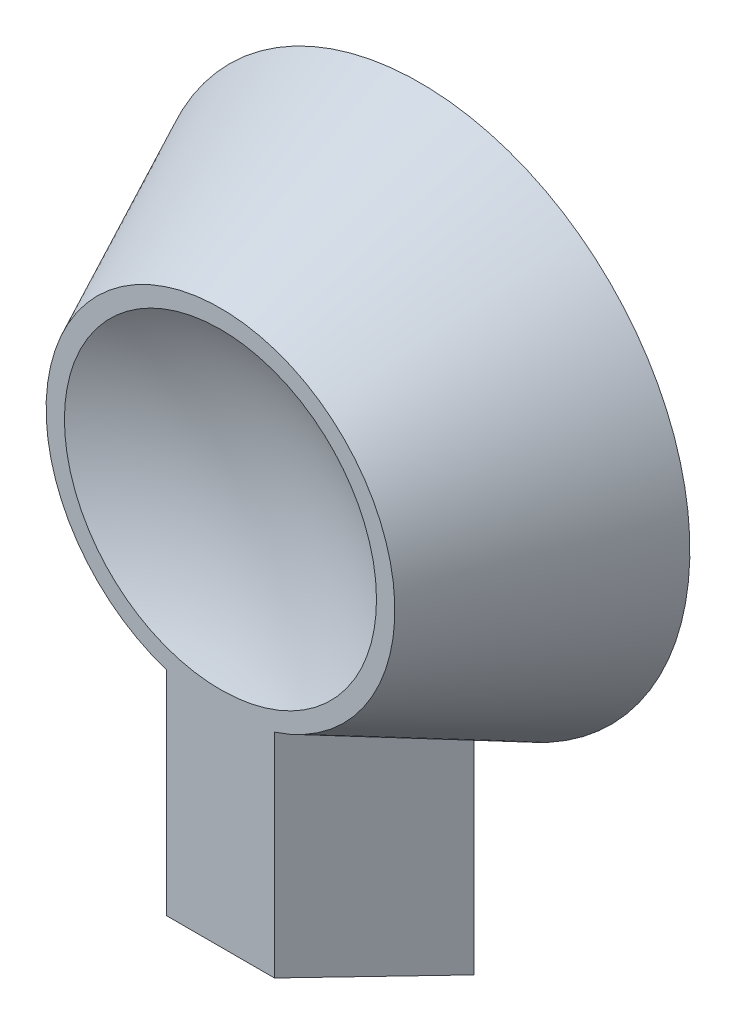
ISO-10303-21;
HEADER;
FILE_DESCRIPTION(('STEP AP214'),'2;1');
FILE_NAME('part.step','',(''),(''),'','','');
FILE_SCHEMA(('AUTOMOTIVE_DESIGN { 1 0 10303 214 1 1 1 1 }'));
ENDSEC;
DATA;
#1=APPLICATION_CONTEXT('core data for automotive mechanical design processes');
#2=APPLICATION_PROTOCOL_DEFINITION('international standard','automotive_design',2000,#1);
#3=PRODUCT_CONTEXT('',#1,'mechanical');
#4=PRODUCT('Part','Part','',(#3));
#5=PRODUCT_RELATED_PRODUCT_CATEGORY('part','',(#4));
#6=PRODUCT_DEFINITION_FORMATION('','',#4);
#7=PRODUCT_DEFINITION_CONTEXT('part definition',#1,'design');
#8=PRODUCT_DEFINITION('design','',#6,#7);
#9=PRODUCT_DEFINITION_SHAPE('','',#8);
#10=(LENGTH_UNIT() NAMED_UNIT(*) SI_UNIT(.MILLI.,.METRE.));
#11=(NAMED_UNIT(*) PLANE_ANGLE_UNIT() SI_UNIT($,.RADIAN.));
#12=(NAMED_UNIT(*) SI_UNIT($,.STERADIAN.) SOLID_ANGLE_UNIT());
#13=UNCERTAINTY_MEASURE_WITH_UNIT(LENGTH_MEASURE(1.E-05),#10,'distance_accuracy_value','');
#14=(GEOMETRIC_REPRESENTATION_CONTEXT(3) GLOBAL_UNCERTAINTY_ASSIGNED_CONTEXT((#13)) GLOBAL_UNIT_ASSIGNED_CONTEXT((#10,
#11,#12)) REPRESENTATION_CONTEXT('',''));
#15=CARTESIAN_POINT('',(0.,0.,0.));
#16=DIRECTION('',(0.,0.,1.));
#17=DIRECTION('',(1.,0.,0.));
#18=AXIS2_PLACEMENT_3D('',#15,#16,#17);
#19=CARTESIAN_POINT('',(1.75,-0.8658834987988,0.));
#20=DIRECTION('',(1.,0.,0.));
#21=DIRECTION('',(0.,0.,-1.));
#22=AXIS2_PLACEMENT_3D('',#19,#20,#21);
#23=PLANE('',#22);
#24=DIRECTION('',(0.,1.,0.));
#25=VECTOR('',#24,1.);
#26=CARTESIAN_POINT('',(1.75,3.817865,4.3));
#27=LINE('',#26,#25);
#28=CARTESIAN_POINT('',(1.75,-0.865883498798799,4.3));
#29=VERTEX_POINT('',#28);
#30=CARTESIAN_POINT('',(1.75000000000007,-1.92125514162448,4.3));
#31=VERTEX_POINT('',#30);
#32=EDGE_CURVE('E243',#29,#31,#27,.F.);
#33=ORIENTED_EDGE('',*,*,#32,.F.);
#34=DIRECTION('',(0.,0.,-1.));
#35=VECTOR('',#34,1.);
#36=CARTESIAN_POINT('',(1.75,-0.865883498798799,0.));
#37=LINE('',#36,#35);
#38=CARTESIAN_POINT('',(1.75,-0.865883498798799,0.));
#39=VERTEX_POINT('',#38);
#40=EDGE_CURVE('E240',#39,#29,#37,.F.);
#41=ORIENTED_EDGE('',*,*,#40,.F.);
#42=DIRECTION('',(0.,1.,0.));
#43=VECTOR('',#42,1.);
#44=CARTESIAN_POINT('',(1.75,-0.8658834987988,0.));
#45=LINE('',#44,#43);
#46=CARTESIAN_POINT('',(1.75000000000007,-1.92125514162448,0.));
#47=VERTEX_POINT('',#46);
#48=EDGE_CURVE('E262',#47,#39,#45,.T.);
#49=ORIENTED_EDGE('',*,*,#48,.F.);
#50=DIRECTION('',(0.,0.,-1.));
#51=VECTOR('',#50,1.);
#52=CARTESIAN_POINT('',(1.75000000000014,-1.92125514162446,0.));
#53=LINE('',#52,#51);
#54=EDGE_CURVE('E254',#47,#31,#53,.F.);
#55=ORIENTED_EDGE('',*,*,#54,.T.);
#56=EDGE_LOOP('',(#33,#41,#49,#55));
#57=FACE_BOUND('',#56,.T.);
#58=ADVANCED_FACE('F15',(#57),#23,.F.);
#59=CARTESIAN_POINT('',(1.75,9.556985141624,0.));
#60=DIRECTION('',(1.,0.,0.));
#61=DIRECTION('',(0.,0.,-1.));
#62=AXIS2_PLACEMENT_3D('',#59,#60,#61);
#63=PLANE('',#62);
#64=DIRECTION('',(0.,1.,0.));
#65=VECTOR('',#64,1.);
#66=CARTESIAN_POINT('',(1.75,3.817865,4.3));
#67=LINE('',#66,#65);
#68=CARTESIAN_POINT('',(1.75000000000007,9.55698514162448,4.3));
#69=VERTEX_POINT('',#68);
#70=CARTESIAN_POINT('',(1.74999999999997,8.50161349879881,4.3));
#71=VERTEX_POINT('',#70);
#72=EDGE_CURVE('E251',#69,#71,#67,.F.);
#73=ORIENTED_EDGE('',*,*,#72,.F.);
#74=DIRECTION('',(0.,0.,-1.));
#75=VECTOR('',#74,1.);
#76=CARTESIAN_POINT('',(1.75000000000014,9.55698514162446,0.));
#77=LINE('',#76,#75);
#78=CARTESIAN_POINT('',(1.75000000000007,9.55698514162448,0.));
#79=VERTEX_POINT('',#78);
#80=EDGE_CURVE('E227',#69,#79,#77,.T.);
#81=ORIENTED_EDGE('',*,*,#80,.T.);
#82=DIRECTION('',(0.,1.,0.));
#83=VECTOR('',#82,1.);
#84=CARTESIAN_POINT('',(1.75,9.556985141624,0.));
#85=LINE('',#84,#83);
#86=CARTESIAN_POINT('',(1.74999999999997,8.50161349879881,0.));
#87=VERTEX_POINT('',#86);
#88=EDGE_CURVE('E260',#87,#79,#85,.T.);
#89=ORIENTED_EDGE('',*,*,#88,.F.);
#90=DIRECTION('',(0.,0.,-1.));
#91=VECTOR('',#90,1.);
#92=CARTESIAN_POINT('',(1.74999999999993,8.50161349879882,0.));
#93=LINE('',#92,#91);
#94=EDGE_CURVE('E228',#71,#87,#93,.T.);
#95=ORIENTED_EDGE('',*,*,#94,.F.);
#96=EDGE_LOOP('',(#73,#81,#89,#95));
#97=FACE_BOUND('',#96,.T.);
#98=ADVANCED_FACE('F310',(#97),#63,.F.);
#99=CARTESIAN_POINT('',(0.,3.817865,0.));
#100=DIRECTION('',(0.,0.,-1.));
#101=DIRECTION('',(-1.,0.,0.));
#102=AXIS2_PLACEMENT_3D('',#99,#100,#101);
#103=CYLINDRICAL_SURFACE('',#102,6.);
#104=ORIENTED_EDGE('',*,*,#54,.F.);
#105=CARTESIAN_POINT('',(0.,3.817865,0.));
#106=DIRECTION('',(0.,0.,-1.));
#107=DIRECTION('',(-1.,0.,0.));
#108=AXIS2_PLACEMENT_3D('',#105,#106,#107);
#109=CIRCLE('',#108,6.);
#110=CARTESIAN_POINT('',(1.59687194226616,-1.965732496369,0.));
#111=VERTEX_POINT('',#110);
#112=EDGE_CURVE('E18',#111,#47,#109,.F.);
#113=ORIENTED_EDGE('',*,*,#112,.F.);
#114=DIRECTION('',(0.,0.,1.));
#115=VECTOR('',#114,1.);
#116=CARTESIAN_POINT('',(1.596871942267,-1.965732496369,0.));
#117=LINE('',#116,#115);
#118=CARTESIAN_POINT('',(1.59687194226616,-1.965732496369,4.3));
#119=VERTEX_POINT('',#118);
#120=EDGE_CURVE('E274',#119,#111,#117,.F.);
#121=ORIENTED_EDGE('',*,*,#120,.F.);
#122=CARTESIAN_POINT('',(0.,3.817865,4.3));
#123=DIRECTION('',(0.,0.,-1.));
#124=DIRECTION('',(-1.,0.,0.));
#125=AXIS2_PLACEMENT_3D('',#122,#123,#124);
#126=CIRCLE('',#125,6.);
#127=EDGE_CURVE('E241',#31,#119,#126,.T.);
#128=ORIENTED_EDGE('',*,*,#127,.F.);
#129=EDGE_LOOP('',(#104,#113,#121,#128));
#130=FACE_BOUND('',#129,.T.);
#131=ADVANCED_FACE('F273',(#130),#103,.F.);
#132=CARTESIAN_POINT('',(0.,3.817865,4.3));
#133=DIRECTION('',(0.,0.,-1.));
#134=DIRECTION('',(-1.,0.,0.));
#135=AXIS2_PLACEMENT_3D('',#132,#133,#134);
#136=PLANE('',#135);
#137=ORIENTED_EDGE('',*,*,#127,.T.);
#138=DIRECTION('',(1.,0.,0.));
#139=VECTOR('',#138,1.);
#140=CARTESIAN_POINT('',(-2.,-1.965732496369,4.3));
#141=LINE('',#140,#139);
#142=CARTESIAN_POINT('',(-1.59687194226616,-1.965732496369,4.3));
#143=VERTEX_POINT('',#142);
#144=EDGE_CURVE('E129',#143,#119,#141,.T.);
#145=ORIENTED_EDGE('',*,*,#144,.F.);
#146=CARTESIAN_POINT('',(0.,3.817865,4.3));
#147=DIRECTION('',(0.,0.,-1.));
#148=DIRECTION('',(-1.,0.,0.));
#149=AXIS2_PLACEMENT_3D('',#146,#147,#148);
#150=CIRCLE('',#149,6.);
#151=EDGE_CURVE('E224',#143,#69,#150,.T.);
#152=ORIENTED_EDGE('',*,*,#151,.T.);
#153=ORIENTED_EDGE('',*,*,#72,.T.);
#154=CARTESIAN_POINT('',(0.,3.817865,4.3));
#155=DIRECTION('',(0.,0.,-1.));
#156=DIRECTION('',(-1.,0.,0.));
#157=AXIS2_PLACEMENT_3D('',#154,#155,#156);
#158=CIRCLE('',#157,5.);
#159=CARTESIAN_POINT('',(-4.89897948556635,4.81786500000004,4.3));
#160=VERTEX_POINT('',#159);
#161=EDGE_CURVE('E229',#160,#71,#158,.T.);
#162=ORIENTED_EDGE('',*,*,#161,.F.);
#163=DIRECTION('',(1.,0.,0.));
#164=VECTOR('',#163,1.);
#165=CARTESIAN_POINT('',(-4.898979485566,4.817865,4.3));
#166=LINE('',#165,#164);
#167=CARTESIAN_POINT('',(-2.93428015022412,4.817865,4.3));
#168=VERTEX_POINT('',#167);
#169=EDGE_CURVE('E263',#160,#168,#166,.T.);
#170=ORIENTED_EDGE('',*,*,#169,.T.);
#171=CARTESIAN_POINT('',(0.,3.817865,4.3));
#172=DIRECTION('',(0.,0.,-1.));
#173=DIRECTION('',(-1.,0.,0.));
#174=AXIS2_PLACEMENT_3D('',#171,#172,#173);
#175=CIRCLE('',#174,3.1);
#176=CARTESIAN_POINT('',(-2.93428015022423,2.81786499999996,4.3));
#177=VERTEX_POINT('',#176);
#178=EDGE_CURVE('E233',#168,#177,#175,.T.);
#179=ORIENTED_EDGE('',*,*,#178,.T.);
#180=DIRECTION('',(1.,0.,0.));
#181=VECTOR('',#180,1.);
#182=CARTESIAN_POINT('',(-2.934280150224,2.817865,4.3));
#183=LINE('',#182,#181);
#184=CARTESIAN_POINT('',(-4.89897948556618,2.817865,4.3));
#185=VERTEX_POINT('',#184);
#186=EDGE_CURVE('E239',#177,#185,#183,.F.);
#187=ORIENTED_EDGE('',*,*,#186,.T.);
#188=CARTESIAN_POINT('',(0.,3.817865,4.3));
#189=DIRECTION('',(0.,0.,-1.));
#190=DIRECTION('',(-1.,0.,0.));
#191=AXIS2_PLACEMENT_3D('',#188,#189,#190);
#192=CIRCLE('',#191,5.);
#193=EDGE_CURVE('E237',#29,#185,#192,.T.);
#194=ORIENTED_EDGE('',*,*,#193,.F.);
#195=ORIENTED_EDGE('',*,*,#32,.T.);
#196=EDGE_LOOP('',(#137,#145,#152,#153,#162,#170,#179,#187,#194,#195));
#197=FACE_BOUND('',#196,.T.);
#198=ADVANCED_FACE('F406',(#197),#136,.T.);
#199=CARTESIAN_POINT('',(0.,3.817865,0.));
#200=DIRECTION('',(0.,0.,-1.));
#201=DIRECTION('',(-1.,0.,0.));
#202=AXIS2_PLACEMENT_3D('',#199,#200,#201);
#203=CYLINDRICAL_SURFACE('',#202,5.);
#204=DIRECTION('',(0.,0.,-1.));
#205=VECTOR('',#204,1.);
#206=CARTESIAN_POINT('',(-4.898979485566,2.817865,0.));
#207=LINE('',#206,#205);
#208=CARTESIAN_POINT('',(-4.89897948556618,2.817865,0.));
#209=VERTEX_POINT('',#208);
#210=EDGE_CURVE('E236',#185,#209,#207,.T.);
#211=ORIENTED_EDGE('',*,*,#210,.T.);
#212=CARTESIAN_POINT('',(0.,3.817865,0.));
#213=DIRECTION('',(0.,0.,-1.));
#214=DIRECTION('',(-1.,0.,0.));
#215=AXIS2_PLACEMENT_3D('',#212,#213,#214);
#216=CIRCLE('',#215,5.);
#217=EDGE_CURVE('E135',#39,#209,#216,.T.);
#218=ORIENTED_EDGE('',*,*,#217,.F.);
#219=ORIENTED_EDGE('',*,*,#40,.T.);
#220=ORIENTED_EDGE('',*,*,#193,.T.);
#221=EDGE_LOOP('',(#211,#218,#219,#220));
#222=FACE_BOUND('',#221,.T.);
#223=ADVANCED_FACE('F291',(#222),#203,.T.);
#224=CARTESIAN_POINT('',(-2.934280150224,2.817865,0.));
#225=DIRECTION('',(0.,-1.,0.));
#226=DIRECTION('',(0.,0.,-1.));
#227=AXIS2_PLACEMENT_3D('',#224,#225,#226);
#228=PLANE('',#227);
#229=ORIENTED_EDGE('',*,*,#186,.F.);
#230=DIRECTION('',(0.,0.,-1.));
#231=VECTOR('',#230,1.);
#232=CARTESIAN_POINT('',(-2.93428015022422,2.81786499999993,7.77));
#233=LINE('',#232,#231);
#234=CARTESIAN_POINT('',(-2.93428015022423,2.81786499999996,0.));
#235=VERTEX_POINT('',#234);
#236=EDGE_CURVE('E235',#177,#235,#233,.T.);
#237=ORIENTED_EDGE('',*,*,#236,.T.);
#238=DIRECTION('',(-1.,0.,0.));
#239=VECTOR('',#238,1.);
#240=CARTESIAN_POINT('',(0.,2.817865,0.));
#241=LINE('',#240,#239);
#242=EDGE_CURVE('E144',#209,#235,#241,.F.);
#243=ORIENTED_EDGE('',*,*,#242,.F.);
#244=ORIENTED_EDGE('',*,*,#210,.F.);
#245=EDGE_LOOP('',(#229,#237,#243,#244));
#246=FACE_BOUND('',#245,.T.);
#247=ADVANCED_FACE('F294',(#246),#228,.F.);
#248=CARTESIAN_POINT('',(0.,3.817865,7.77));
#249=DIRECTION('',(0.,0.,-1.));
#250=DIRECTION('',(-1.,0.,0.));
#251=AXIS2_PLACEMENT_3D('',#248,#249,#250);
#252=CYLINDRICAL_SURFACE('',#251,3.1);
#253=ORIENTED_EDGE('',*,*,#178,.F.);
#254=DIRECTION('',(0.,0.,1.));
#255=VECTOR('',#254,1.);
#256=CARTESIAN_POINT('',(-2.934280150224,4.817865,0.));
#257=LINE('',#256,#255);
#258=CARTESIAN_POINT('',(-2.93428015022412,4.817865,0.));
#259=VERTEX_POINT('',#258);
#260=EDGE_CURVE('E265',#168,#259,#257,.F.);
#261=ORIENTED_EDGE('',*,*,#260,.T.);
#262=CARTESIAN_POINT('',(0.,3.817865,0.));
#263=DIRECTION('',(0.,0.,-1.));
#264=DIRECTION('',(-1.,0.,0.));
#265=AXIS2_PLACEMENT_3D('',#262,#263,#264);
#266=CIRCLE('',#265,3.1);
#267=EDGE_CURVE('E213',#235,#259,#266,.F.);
#268=ORIENTED_EDGE('',*,*,#267,.F.);
#269=ORIENTED_EDGE('',*,*,#236,.F.);
#270=EDGE_LOOP('',(#253,#261,#268,#269));
#271=FACE_BOUND('',#270,.T.);
#272=ADVANCED_FACE('F298',(#271),#252,.F.);
#273=CARTESIAN_POINT('',(-4.898979485566,4.817865,0.));
#274=DIRECTION('',(0.,1.,0.));
#275=DIRECTION('',(0.,0.,1.));
#276=AXIS2_PLACEMENT_3D('',#273,#274,#275);
#277=PLANE('',#276);
#278=ORIENTED_EDGE('',*,*,#169,.F.);
#279=DIRECTION('',(0.,0.,-1.));
#280=VECTOR('',#279,1.);
#281=CARTESIAN_POINT('',(-4.89897948556634,4.81786500000007,0.));
#282=LINE('',#281,#280);
#283=CARTESIAN_POINT('',(-4.89897948556635,4.81786500000004,0.));
#284=VERTEX_POINT('',#283);
#285=EDGE_CURVE('E232',#284,#160,#282,.F.);
#286=ORIENTED_EDGE('',*,*,#285,.F.);
#287=DIRECTION('',(-1.,0.,0.));
#288=VECTOR('',#287,1.);
#289=CARTESIAN_POINT('',(0.,4.817865,0.));
#290=LINE('',#289,#288);
#291=EDGE_CURVE('E210',#259,#284,#290,.T.);
#292=ORIENTED_EDGE('',*,*,#291,.F.);
#293=ORIENTED_EDGE('',*,*,#260,.F.);
#294=EDGE_LOOP('',(#278,#286,#292,#293));
#295=FACE_BOUND('',#294,.T.);
#296=ADVANCED_FACE('F301',(#295),#277,.F.);
#297=CARTESIAN_POINT('',(0.,3.817865,0.));
#298=DIRECTION('',(0.,0.,-1.));
#299=DIRECTION('',(-1.,0.,0.));
#300=AXIS2_PLACEMENT_3D('',#297,#298,#299);
#301=CYLINDRICAL_SURFACE('',#300,5.);
#302=ORIENTED_EDGE('',*,*,#94,.T.);
#303=CARTESIAN_POINT('',(0.,3.817865,0.));
#304=DIRECTION('',(0.,0.,-1.));
#305=DIRECTION('',(-1.,0.,0.));
#306=AXIS2_PLACEMENT_3D('',#303,#304,#305);
#307=CIRCLE('',#306,5.);
#308=EDGE_CURVE('E212',#284,#87,#307,.T.);
#309=ORIENTED_EDGE('',*,*,#308,.F.);
#310=ORIENTED_EDGE('',*,*,#285,.T.);
#311=ORIENTED_EDGE('',*,*,#161,.T.);
#312=EDGE_LOOP('',(#302,#309,#310,#311));
#313=FACE_BOUND('',#312,.T.);
#314=ADVANCED_FACE('F305',(#313),#301,.T.);
#315=CARTESIAN_POINT('',(0.,3.817865,0.));
#316=DIRECTION('',(0.,0.,-1.));
#317=DIRECTION('',(-1.,0.,0.));
#318=AXIS2_PLACEMENT_3D('',#315,#316,#317);
#319=CYLINDRICAL_SURFACE('',#318,6.);
#320=ORIENTED_EDGE('',*,*,#80,.F.);
#321=ORIENTED_EDGE('',*,*,#151,.F.);
#322=DIRECTION('',(0.,0.,1.));
#323=VECTOR('',#322,1.);
#324=CARTESIAN_POINT('',(-1.596871942267,-1.965732496369,0.));
#325=LINE('',#324,#323);
#326=CARTESIAN_POINT('',(-1.59687194226616,-1.965732496369,0.));
#327=VERTEX_POINT('',#326);
#328=EDGE_CURVE('E259',#327,#143,#325,.T.);
#329=ORIENTED_EDGE('',*,*,#328,.F.);
#330=CARTESIAN_POINT('',(0.,3.817865,0.));
#331=DIRECTION('',(0.,0.,-1.));
#332=DIRECTION('',(-1.,0.,0.));
#333=AXIS2_PLACEMENT_3D('',#330,#331,#332);
#334=CIRCLE('',#333,6.);
#335=EDGE_CURVE('E175',#79,#327,#334,.F.);
#336=ORIENTED_EDGE('',*,*,#335,.F.);
#337=EDGE_LOOP('',(#320,#321,#329,#336));
#338=FACE_BOUND('',#337,.T.);
#339=ADVANCED_FACE('F312',(#338),#319,.F.);
#340=CARTESIAN_POINT('',(-2.,-1.965732496369,0.));
#341=DIRECTION('',(0.,1.,0.));
#342=DIRECTION('',(0.,0.,1.));
#343=AXIS2_PLACEMENT_3D('',#340,#341,#342);
#344=PLANE('',#343);
#345=ORIENTED_EDGE('',*,*,#328,.T.);
#346=ORIENTED_EDGE('',*,*,#144,.T.);
#347=ORIENTED_EDGE('',*,*,#120,.T.);
#348=DIRECTION('',(-1.,0.,0.));
#349=VECTOR('',#348,1.);
#350=CARTESIAN_POINT('',(0.,-1.965732496369,0.));
#351=LINE('',#350,#349);
#352=EDGE_CURVE('E208',#327,#111,#351,.F.);
#353=ORIENTED_EDGE('',*,*,#352,.F.);
#354=EDGE_LOOP('',(#345,#346,#347,#353));
#355=FACE_BOUND('',#354,.T.);
#356=ADVANCED_FACE('F313',(#355),#344,.T.);
#357=CARTESIAN_POINT('',(-2.,-10.22173249637,7.4));
#358=DIRECTION('',(0.,-0.899235088745799,0.4374657188493));
#359=DIRECTION('',(0.,-0.4374657188493,-0.899235088745799));
#360=AXIS2_PLACEMENT_3D('',#357,#358,#359);
#361=PLANE('',#360);
#362=DIRECTION('',(-1.,0.,0.));
#363=VECTOR('',#362,1.);
#364=CARTESIAN_POINT('',(0.,-10.22173249637,7.4));
#365=LINE('',#364,#363);
#366=CARTESIAN_POINT('',(2.,-10.22173249637,7.4));
#367=VERTEX_POINT('',#366);
#368=CARTESIAN_POINT('',(-2.,-10.22173249637,7.4));
#369=VERTEX_POINT('',#368);
#370=EDGE_CURVE('E195',#367,#369,#365,.T.);
#371=ORIENTED_EDGE('',*,*,#370,.T.);
#372=DIRECTION('',(0.,-0.437465718849306,-0.899235088745796));
#373=VECTOR('',#372,1.);
#374=CARTESIAN_POINT('',(-2.,-10.22173249637,7.4));
#375=LINE('',#374,#373);
#376=CARTESIAN_POINT('',(-2.,-13.82173249637,0.));
#377=VERTEX_POINT('',#376);
#378=EDGE_CURVE('E114',#369,#377,#375,.T.);
#379=ORIENTED_EDGE('',*,*,#378,.T.);
#380=DIRECTION('',(-1.,0.,0.));
#381=VECTOR('',#380,1.);
#382=CARTESIAN_POINT('',(0.,-13.82173249637,0.));
#383=LINE('',#382,#381);
#384=CARTESIAN_POINT('',(2.,-13.82173249637,0.));
#385=VERTEX_POINT('',#384);
#386=EDGE_CURVE('E131',#385,#377,#383,.T.);
#387=ORIENTED_EDGE('',*,*,#386,.F.);
#388=DIRECTION('',(0.,-0.437465718849306,-0.899235088745796));
#389=VECTOR('',#388,1.);
#390=CARTESIAN_POINT('',(2.,-10.22173249637,7.4));
#391=LINE('',#390,#389);
#392=EDGE_CURVE('E121',#367,#385,#391,.T.);
#393=ORIENTED_EDGE('',*,*,#392,.F.);
#394=EDGE_LOOP('',(#371,#379,#387,#393));
#395=FACE_BOUND('',#394,.T.);
#396=ADVANCED_FACE('F132',(#395),#361,.T.);
#397=CARTESIAN_POINT('',(0.,3.817865,17.8));
#398=DIRECTION('',(0.,1.,0.));
#399=DIRECTION('',(1.,0.,0.));
#400=AXIS2_PLACEMENT_3D('',#397,#398,#399);
#401=SPHERICAL_SURFACE('',#400,11.9);
#402=CARTESIAN_POINT('',(0.,9.6014624963685,7.4));
#403=CARTESIAN_POINT('',(-0.162385112842373,9.6014615999479,7.4));
#404=CARTESIAN_POINT('',(-0.324799662774053,9.59461788359165,7.4));
#405=CARTESIAN_POINT('',(-0.648509002274006,9.56728538636666,7.4));
#406=CARTESIAN_POINT('',(-0.809803447044471,9.54679257704734,7.4));
#407=CARTESIAN_POINT('',(-1.13035452130641,9.49226093474803,7.4));
#408=CARTESIAN_POINT('',(-1.28960749980464,9.45820059902386,7.4));
#409=CARTESIAN_POINT('',(-1.60480248432001,9.37674325120136,7.4));
#410=CARTESIAN_POINT('',(-1.76074169254806,9.32933541626701,7.4));
#411=CARTESIAN_POINT('',(-2.06779995174507,9.2216256375165,7.4));
#412=CARTESIAN_POINT('',(-2.21892683964794,9.16134603496777,7.4));
#413=CARTESIAN_POINT('',(-2.51563404224363,9.02824265569629,7.4));
#414=CARTESIAN_POINT('',(-2.66121181413952,8.95541321061988,7.4));
#415=CARTESIAN_POINT('',(-2.94571843084404,8.79774399336454,7.4));
#416=CARTESIAN_POINT('',(-3.0846470252759,8.71290376939151,7.4));
#417=CARTESIAN_POINT('',(-3.35480012443071,8.5318595021097,7.4));
#418=CARTESIAN_POINT('',(-3.4860280809834,8.43566060950822,7.4));
#419=CARTESIAN_POINT('',(-3.73999751829261,8.23248623481109,7.4));
#420=CARTESIAN_POINT('',(-3.86273346057584,8.12550382940401,7.4));
#421=CARTESIAN_POINT('',(-4.0986383579975,7.90168365966581,7.4));
#422=CARTESIAN_POINT('',(-4.2118164230588,7.78485549683446,7.4));
#423=CARTESIAN_POINT('',(-4.42798297598401,7.54202957569374,7.4));
#424=CARTESIAN_POINT('',(-4.53096682483061,7.41602768760781,7.4));
#425=CARTESIAN_POINT('',(-4.72597716427352,7.15576661313264,7.4));
#426=CARTESIAN_POINT('',(-4.81800111149726,7.02150552101891,7.4));
#427=CARTESIAN_POINT('',(-4.99038038122151,6.74575385559565,7.4));
#428=CARTESIAN_POINT('',(-5.07073963414182,6.60426573925796,7.4));
#429=CARTESIAN_POINT('',(-5.21928283170522,6.31497045061441,7.4));
#430=CARTESIAN_POINT('',(-5.28746227899115,6.16716096902873,7.4));
#431=CARTESIAN_POINT('',(-5.41110091054866,5.86638049614845,7.4));
#432=CARTESIAN_POINT('',(-5.46656494321386,5.71341149778732,7.4));
#433=CARTESIAN_POINT('',(-5.56443027611718,5.40328740140273,7.4));
#434=CARTESIAN_POINT('',(-5.60682667959787,5.24613075807557,7.4));
#435=CARTESIAN_POINT('',(-5.67821249740234,4.92886897512301,7.4));
#436=CARTESIAN_POINT('',(-5.70720737740913,4.76876506526371,7.4));
#437=CARTESIAN_POINT('',(-5.75161971452016,4.44661099763155,7.4));
#438=CARTESIAN_POINT('',(-5.76703101299272,4.28455999078391,7.4));
#439=CARTESIAN_POINT('',(-5.78414415644978,3.95973570398962,7.4));
#440=CARTESIAN_POINT('',(-5.78584600143428,3.79696242404296,7.4));
#441=CARTESIAN_POINT('',(-5.77553049852065,3.47192505791524,7.4));
#442=CARTESIAN_POINT('',(-5.76351936437878,3.30966077449011,7.4));
#443=CARTESIAN_POINT('',(-5.72586563703813,2.98665431832677,7.4));
#444=CARTESIAN_POINT('',(-5.70021747919375,2.82591279422939,7.4));
#445=CARTESIAN_POINT('',(-5.63548081845778,2.50722212398723,7.4));
#446=CARTESIAN_POINT('',(-5.59639734759144,2.34927195562983,7.4));
#447=CARTESIAN_POINT('',(-5.50504826719824,2.03716500346307,7.4));
#448=CARTESIAN_POINT('',(-5.45277762670662,1.88300969210002,7.4));
#449=CARTESIAN_POINT('',(-5.33545502137941,1.57970744704908,7.4));
#450=CARTESIAN_POINT('',(-5.27040777165613,1.43055868943395,7.4));
#451=CARTESIAN_POINT('',(-5.1279579256364,1.13822046924486,7.4));
#452=CARTESIAN_POINT('',(-5.05055116250746,0.995033037044583,7.4));
#453=CARTESIAN_POINT('',(-4.88396782599618,0.715721649211259,7.4));
#454=CARTESIAN_POINT('',(-4.79479398215427,0.57959606565351,7.4));
#455=CARTESIAN_POINT('',(-4.60533951800688,0.315400281061787,7.4));
#456=CARTESIAN_POINT('',(-4.50506394498193,0.187326460567181,7.4));
#457=CARTESIAN_POINT('',(-4.29398333931503,-0.0600428320308548,7.4));
#458=CARTESIAN_POINT('',(-4.18316823828545,-0.179329713030581,7.4));
#459=CARTESIAN_POINT('',(-3.95195369887302,-0.408065670818209,7.4));
#460=CARTESIAN_POINT('',(-3.83156049578354,-0.517521050624768,7.4));
#461=CARTESIAN_POINT('',(-3.58192652126181,-0.72594994128785,7.4));
#462=CARTESIAN_POINT('',(-3.45268177588815,-0.824918692658699,7.4));
#463=CARTESIAN_POINT('',(-3.18631756425279,-1.0116101594654,7.4));
#464=CARTESIAN_POINT('',(-3.04919839445496,-1.09933329788545,7.4));
#465=CARTESIAN_POINT('',(-2.76811983454999,-1.26287692144624,7.4));
#466=CARTESIAN_POINT('',(-2.62416356877649,-1.33870277637178,7.4));
#467=CARTESIAN_POINT('',(-2.33012297229394,-1.47808103364229,7.4));
#468=CARTESIAN_POINT('',(-2.18002850048293,-1.54161204188024,7.4));
#469=CARTESIAN_POINT('',(-1.8751376970804,-1.65573818164884,7.4));
#470=CARTESIAN_POINT('',(-1.72034528502043,-1.7063437821181,7.4));
#471=CARTESIAN_POINT('',(-1.40729877127778,-1.79425607622944,7.4));
#472=CARTESIAN_POINT('',(-1.24905055981988,-1.8315837699432,7.4));
#473=CARTESIAN_POINT('',(-0.930005261094637,-1.89277935185373,7.4));
#474=CARTESIAN_POINT('',(-0.769208940013688,-1.91665120996966,7.4));
#475=CARTESIAN_POINT('',(-0.506802615986954,-1.9443790252862,7.4));
#476=CARTESIAN_POINT('',(-0.405612974196735,-1.9523840768968,7.4));
#477=CARTESIAN_POINT('',(-0.202952720576787,-1.9630610925457,7.4));
#478=CARTESIAN_POINT('',(-0.101482108747059,-1.96573305658398,7.4));
#479=CARTESIAN_POINT('',(0.162385112842378,-1.96573159994791,7.4));
#480=CARTESIAN_POINT('',(0.324799662774058,-1.95888788359165,7.4));
#481=CARTESIAN_POINT('',(0.648509002274011,-1.93155538636667,7.4));
#482=CARTESIAN_POINT('',(0.809803447044476,-1.91106257704734,7.4));
#483=CARTESIAN_POINT('',(1.13035452130642,-1.85653093474802,7.4));
#484=CARTESIAN_POINT('',(1.28960749980465,-1.82247059902386,7.4));
#485=CARTESIAN_POINT('',(1.60480248432002,-1.74101325120136,7.4));
#486=CARTESIAN_POINT('',(1.76074169254807,-1.693605416267,7.4));
#487=CARTESIAN_POINT('',(2.06779995174507,-1.58589563751649,7.4));
#488=CARTESIAN_POINT('',(2.21892683964795,-1.52561603496777,7.4));
#489=CARTESIAN_POINT('',(2.51563404224364,-1.39251265569629,7.4));
#490=CARTESIAN_POINT('',(2.66121181413952,-1.31968321061987,7.4));
#491=CARTESIAN_POINT('',(2.94571843084404,-1.16201399336453,7.4));
#492=CARTESIAN_POINT('',(3.08464702527591,-1.0771737693915,7.4));
#493=CARTESIAN_POINT('',(3.35480012443072,-0.896129502109691,7.4));
#494=CARTESIAN_POINT('',(3.48602808098341,-0.799930609508213,7.4));
#495=CARTESIAN_POINT('',(3.73999751829261,-0.596756234811081,7.4));
#496=CARTESIAN_POINT('',(3.86273346057585,-0.489773829403998,7.4));
#497=CARTESIAN_POINT('',(4.09863835799751,-0.265953659665806,7.4));
#498=CARTESIAN_POINT('',(4.21181642305881,-0.14912549683446,7.4));
#499=CARTESIAN_POINT('',(4.42798297598402,0.0937004243062649,7.4));
#500=CARTESIAN_POINT('',(4.53096682483061,0.219702312392198,7.4));
#501=CARTESIAN_POINT('',(4.72597716427352,0.47996338686737,7.4));
#502=CARTESIAN_POINT('',(4.81800111149726,0.614224478981093,7.4));
#503=CARTESIAN_POINT('',(4.99038038122152,0.889976144404353,7.4));
#504=CARTESIAN_POINT('',(5.07073963414182,1.03146426074205,7.4));
#505=CARTESIAN_POINT('',(5.21928283170522,1.32075954938559,7.4));
#506=CARTESIAN_POINT('',(5.28746227899116,1.46856903097127,7.4));
#507=CARTESIAN_POINT('',(5.41110091054867,1.76934950385156,7.4));
#508=CARTESIAN_POINT('',(5.46656494321387,1.92231850221269,7.4));
#509=CARTESIAN_POINT('',(5.56443027611718,2.23244259859728,7.4));
#510=CARTESIAN_POINT('',(5.60682667959788,2.38959924192444,7.4));
#511=CARTESIAN_POINT('',(5.67821249740235,2.706861024877,7.4));
#512=CARTESIAN_POINT('',(5.70720737740914,2.8669649347363,7.4));
#513=CARTESIAN_POINT('',(5.75161971452017,3.18911900236846,7.4));
#514=CARTESIAN_POINT('',(5.76703101299272,3.3511700092161,7.4));
#515=CARTESIAN_POINT('',(5.78414415644978,3.67599429601039,7.4));
#516=CARTESIAN_POINT('',(5.78584600143428,3.83876757595705,7.4));
#517=CARTESIAN_POINT('',(5.77553049852065,4.16380494208477,7.4));
#518=CARTESIAN_POINT('',(5.76351936437878,4.3260692255099,7.4));
#519=CARTESIAN_POINT('',(5.72586563703812,4.64907568167324,7.4));
#520=CARTESIAN_POINT('',(5.70021747919375,4.80981720577062,7.4));
#521=CARTESIAN_POINT('',(5.63548081845778,5.12850787601277,7.4));
#522=CARTESIAN_POINT('',(5.59639734759143,5.28645804437018,7.4));
#523=CARTESIAN_POINT('',(5.50504826719824,5.59856499653693,7.4));
#524=CARTESIAN_POINT('',(5.45277762670662,5.75272030789998,7.4));
#525=CARTESIAN_POINT('',(5.33545502137941,6.05602255295093,7.4));
#526=CARTESIAN_POINT('',(5.27040777165613,6.20517131056606,7.4));
#527=CARTESIAN_POINT('',(5.1279579256364,6.49750953075515,7.4));
#528=CARTESIAN_POINT('',(5.05055116250746,6.64069696295542,7.4));
#529=CARTESIAN_POINT('',(4.88396782599617,6.92000835078875,7.4));
#530=CARTESIAN_POINT('',(4.79479398215427,7.0561339343465,7.4));
#531=CARTESIAN_POINT('',(4.60533951800688,7.32032971893822,7.4));
#532=CARTESIAN_POINT('',(4.50506394498192,7.44840353943282,7.4));
#533=CARTESIAN_POINT('',(4.29398333931503,7.69577283203086,7.4));
#534=CARTESIAN_POINT('',(4.18316823828544,7.81505971303059,7.4));
#535=CARTESIAN_POINT('',(3.95195369887302,8.04379567081821,7.4));
#536=CARTESIAN_POINT('',(3.83156049578353,8.15325105062477,7.4));
#537=CARTESIAN_POINT('',(3.5819265212618,8.36167994128785,7.4));
#538=CARTESIAN_POINT('',(3.45268177588814,8.4606486926587,7.4));
#539=CARTESIAN_POINT('',(3.18631756425278,8.64734015946541,7.4));
#540=CARTESIAN_POINT('',(3.04919839445495,8.73506329788545,7.4));
#541=CARTESIAN_POINT('',(2.76811983454998,8.89860692144624,7.4));
#542=CARTESIAN_POINT('',(2.62416356877648,8.97443277637178,7.4));
#543=CARTESIAN_POINT('',(2.33012297229393,9.11381103364229,7.4));
#544=CARTESIAN_POINT('',(2.18002850048292,9.17734204188024,7.4));
#545=CARTESIAN_POINT('',(1.87513769708039,9.29146818164884,7.4));
#546=CARTESIAN_POINT('',(1.72034528502042,9.34207378211811,7.4));
#547=CARTESIAN_POINT('',(1.40729877127777,9.42998607622944,7.4));
#548=CARTESIAN_POINT('',(1.24905055981987,9.4673137699432,7.4));
#549=CARTESIAN_POINT('',(0.930005261094626,9.52850935185373,7.4));
#550=CARTESIAN_POINT('',(0.769208940013677,9.55238120996967,7.4));
#551=CARTESIAN_POINT('',(0.506802615986946,9.5801090252862,7.4));
#552=CARTESIAN_POINT('',(0.40561297419673,9.5881140768968,7.4));
#553=CARTESIAN_POINT('',(0.202952720576787,9.59879109254569,7.4));
#554=CARTESIAN_POINT('',(0.101482108747061,9.60146305658398,7.4));
#555=CARTESIAN_POINT('',(0.,9.6014624963685,7.4));
#556=B_SPLINE_CURVE_WITH_KNOTS('',3,(#402,#403,#404,#405,#406,#407,#408,#409,#410,#411,#412,
#413,#414,#415,#416,#417,#418,#419,#420,#421,#422,#423,#424,#425,#426,#427,#428,#429,#430,#431,
#432,#433,#434,#435,#436,#437,#438,#439,#440,#441,#442,#443,#444,#445,#446,#447,#448,#449,#450,
#451,#452,#453,#454,#455,#456,#457,#458,#459,#460,#461,#462,#463,#464,#465,#466,#467,#468,#469,
#470,#471,#472,#473,#474,#475,#476,#477,#478,#479,#480,#481,#482,#483,#484,#485,#486,#487,#488,
#489,#490,#491,#492,#493,#494,#495,#496,#497,#498,#499,#500,#501,#502,#503,#504,#505,#506,#507,
#508,#509,#510,#511,#512,#513,#514,#515,#516,#517,#518,#519,#520,#521,#522,#523,#524,#525,#526,
#527,#528,#529,#530,#531,#532,#533,#534,#535,#536,#537,#538,#539,#540,#541,#542,#543,#544,#545,
#546,#547,#548,#549,#550,#551,#552,#553,#554,#555),.UNSPECIFIED.,.T.,.F.,(4,2,2,2,2,2,2,2,2,2,2,
2,2,2,2,2,2,2,2,2,2,2,2,2,2,2,2,2,2,2,2,2,2,2,2,2,2,2,2,2,2,2,2,2,2,2,2,2,2,2,2,2,2,2,2,2,2,2,2,
2,2,2,2,2,2,2,2,2,2,2,2,2,2,2,2,2,4),(0.,0.487062416985507,0.974268651356657,1.46225013542296,
1.95062844510207,2.43816587825829,2.92592409610251,3.41370066620138,3.90125689227814,
4.3891281611456,4.87652904862892,5.36415072462702,5.8518853393219,6.33945522839874,
6.82720478075857,7.31476804350748,7.80251378653144,8.29006043121639,8.77782801011965,
9.26559558902292,9.75314223370787,10.2408879767318,10.7284512394807,11.2162007918406,
11.7037706809174,12.1915052956123,12.6791269716104,13.1665278590937,13.6543991279612,
14.1419553540379,14.6297319241368,15.117490141981,15.6050275751372,16.0934058848163,
16.5813873688827,17.0685936032538,17.5556560202393,17.8600442754306,18.1644325306219,
18.6514949476074,19.1387011819785,19.6266826660448,20.115060975724,20.6025984088802,
21.0903566267244,21.5781331968233,22.0656894229,22.5535606917675,23.0409615792508,
23.5285832552489,24.0163178699438,24.5038877590206,24.9916373113805,25.4792005741294,
25.9669463171533,26.4544929618383,26.9422605407415,27.4300281196448,27.9175747643298,
28.4053205073537,28.8928837701026,29.3806333224625,29.8682032115393,30.3559378262342,
30.8435595022323,31.3309603897156,31.8188316585831,32.3063878846598,32.7941644547587,
33.2819226726029,33.7694601057591,34.2578384154382,34.7458198995045,35.2330261338757,
35.7200885508612,36.0244768060525,36.3288650612437),.UNSPECIFIED.);
#557=CARTESIAN_POINT('',(0.,9.6014624963685,7.4));
#558=VERTEX_POINT('',#557);
#559=EDGE_CURVE('E162',#558,#558,#556,.T.);
#560=ORIENTED_EDGE('',*,*,#559,.T.);
#561=EDGE_LOOP('',(#560));
#562=FACE_BOUND('',#561,.T.);
#563=ADVANCED_FACE('F152',(#562),#401,.F.);
#564=CARTESIAN_POINT('',(2.,0.,0.));
#565=DIRECTION('',(1.,0.,0.));
#566=DIRECTION('',(0.,0.,-1.));
#567=AXIS2_PLACEMENT_3D('',#564,#565,#566);
#568=PLANE('',#567);
#569=DIRECTION('',(0.,1.,0.));
#570=VECTOR('',#569,1.);
#571=CARTESIAN_POINT('',(2.,3.817865,0.));
#572=LINE('',#571,#570);
#573=CARTESIAN_POINT('',(2.,-5.98009397113198,-2.15105711021124E-13));
#574=VERTEX_POINT('',#573);
#575=EDGE_CURVE('E124',#574,#385,#572,.F.);
#576=ORIENTED_EDGE('',*,*,#575,.F.);
#577=CARTESIAN_POINT('',(2.,-2.32852358152208,7.40000000000004));
#578=CARTESIAN_POINT('',(2.,-2.48291218258272,7.09277658932486));
#579=CARTESIAN_POINT('',(2.,-2.63686980052484,6.78533711294577));
#580=CARTESIAN_POINT('',(2.,-2.9440620178267,6.17009776676038));
#581=CARTESIAN_POINT('',(2.,-3.09729661846895,5.86229789759456));
#582=CARTESIAN_POINT('',(2.,-3.5561226817186,4.93846860906768));
#583=CARTESIAN_POINT('',(2.,-3.86083887705822,4.32200457956211));
#584=CARTESIAN_POINT('',(2.,-4.468649513723,3.08828215259543));
#585=CARTESIAN_POINT('',(2.,-4.7717439627464,2.47102375892234));
#586=CARTESIAN_POINT('',(2.,-5.37672399090087,1.23590852620105));
#587=CARTESIAN_POINT('',(2.,-5.67860956029618,0.618051682382752));
#588=CARTESIAN_POINT('',(2.,-5.98009397113209,-4.44681580593042E-13));
#589=B_SPLINE_CURVE_WITH_KNOTS('',3,(#577,#578,#579,#580,#581,#582,#583,#584,#585,#586,#587,
#588),.UNSPECIFIED.,.F.,.F.,(4,2,2,2,2,4),(0.,1.03150204274396,2.06300225508097,4.1259861379266,
6.18896021932663,8.25195088169859),.UNSPECIFIED.);
#590=CARTESIAN_POINT('',(2.,-2.32852358152208,7.40000000000004));
#591=VERTEX_POINT('',#590);
#592=EDGE_CURVE('E169',#591,#574,#589,.T.);
#593=ORIENTED_EDGE('',*,*,#592,.F.);
#594=DIRECTION('',(0.,1.,0.));
#595=VECTOR('',#594,1.);
#596=CARTESIAN_POINT('',(2.,3.817865,7.4));
#597=LINE('',#596,#595);
#598=EDGE_CURVE('E127',#591,#367,#597,.F.);
#599=ORIENTED_EDGE('',*,*,#598,.T.);
#600=ORIENTED_EDGE('',*,*,#392,.T.);
#601=EDGE_LOOP('',(#576,#593,#599,#600));
#602=FACE_BOUND('',#601,.T.);
#603=ADVANCED_FACE('F122',(#602),#568,.T.);
#604=CARTESIAN_POINT('',(0.,3.817865,0.));
#605=DIRECTION('',(0.,0.,-1.));
#606=DIRECTION('',(-1.,0.,0.));
#607=AXIS2_PLACEMENT_3D('',#604,#605,#606);
#608=PLANE('',#607);
#609=ORIENTED_EDGE('',*,*,#352,.T.);
#610=ORIENTED_EDGE('',*,*,#112,.T.);
#611=ORIENTED_EDGE('',*,*,#48,.T.);
#612=ORIENTED_EDGE('',*,*,#217,.T.);
#613=ORIENTED_EDGE('',*,*,#242,.T.);
#614=ORIENTED_EDGE('',*,*,#267,.T.);
#615=ORIENTED_EDGE('',*,*,#291,.T.);
#616=ORIENTED_EDGE('',*,*,#308,.T.);
#617=ORIENTED_EDGE('',*,*,#88,.T.);
#618=ORIENTED_EDGE('',*,*,#335,.T.);
#619=EDGE_LOOP('',(#609,#610,#611,#612,#613,#614,#615,#616,#617,#618));
#620=FACE_BOUND('',#619,.T.);
#621=DIRECTION('',(0.,1.,0.));
#622=VECTOR('',#621,1.);
#623=CARTESIAN_POINT('',(-2.,0.,0.));
#624=LINE('',#623,#622);
#625=CARTESIAN_POINT('',(-2.,-5.98009397113198,-2.22358758776595E-13));
#626=VERTEX_POINT('',#625);
#627=EDGE_CURVE('E196',#377,#626,#624,.T.);
#628=ORIENTED_EDGE('',*,*,#627,.T.);
#629=CARTESIAN_POINT('',(0.,3.817865,-4.30211422042248E-13));
#630=DIRECTION('',(0.,0.,-1.));
#631=DIRECTION('',(-1.,0.,0.));
#632=AXIS2_PLACEMENT_3D('',#629,#630,#631);
#633=CIRCLE('',#632,9.99999999999938);
#634=EDGE_CURVE('E139',#574,#626,#633,.F.);
#635=ORIENTED_EDGE('',*,*,#634,.F.);
#636=ORIENTED_EDGE('',*,*,#575,.T.);
#637=ORIENTED_EDGE('',*,*,#386,.T.);
#638=EDGE_LOOP('',(#628,#635,#636,#637));
#639=FACE_BOUND('',#638,.T.);
#640=ADVANCED_FACE('F137',(#620,#639),#608,.T.);
#641=CARTESIAN_POINT('',(-2.,0.,0.));
#642=DIRECTION('',(1.,0.,0.));
#643=DIRECTION('',(0.,0.,-1.));
#644=AXIS2_PLACEMENT_3D('',#641,#642,#643);
#645=PLANE('',#644);
#646=ORIENTED_EDGE('',*,*,#378,.F.);
#647=DIRECTION('',(0.,1.,0.));
#648=VECTOR('',#647,1.);
#649=CARTESIAN_POINT('',(-2.,3.817865,7.4));
#650=LINE('',#649,#648);
#651=CARTESIAN_POINT('',(-2.,-2.3285235815221,7.40000000000002));
#652=VERTEX_POINT('',#651);
#653=EDGE_CURVE('E33',#369,#652,#650,.T.);
#654=ORIENTED_EDGE('',*,*,#653,.T.);
#655=CARTESIAN_POINT('',(-2.,-5.98009397113209,-4.44756388439499E-13));
#656=CARTESIAN_POINT('',(-2.,-5.67860956029618,0.618051682382751));
#657=CARTESIAN_POINT('',(-2.,-5.37672399090087,1.23590852620105));
#658=CARTESIAN_POINT('',(-2.,-4.7717439627464,2.47102375892234));
#659=CARTESIAN_POINT('',(-2.,-4.468649513723,3.08828215259543));
#660=CARTESIAN_POINT('',(-2.,-3.86083887705822,4.32200457956211));
#661=CARTESIAN_POINT('',(-2.,-3.5561226817186,4.93846860906768));
#662=CARTESIAN_POINT('',(-2.,-3.09729661846895,5.86229789759456));
#663=CARTESIAN_POINT('',(-2.,-2.9440620178267,6.17009776676038));
#664=CARTESIAN_POINT('',(-2.,-2.63686980052484,6.78533711294577));
#665=CARTESIAN_POINT('',(-2.,-2.48291218258271,7.09277658932486));
#666=CARTESIAN_POINT('',(-2.,-2.32852358152208,7.40000000000004));
#667=B_SPLINE_CURVE_WITH_KNOTS('',3,(#655,#656,#657,#658,#659,#660,#661,#662,#663,#664,#665,
#666),.UNSPECIFIED.,.F.,.F.,(4,2,2,2,2,4),(0.,2.06299066237196,4.12596474377199,
6.18894862661762,7.22044883895463,8.25195088169859),.UNSPECIFIED.);
#668=EDGE_CURVE('E24',#626,#652,#667,.T.);
#669=ORIENTED_EDGE('',*,*,#668,.F.);
#670=ORIENTED_EDGE('',*,*,#627,.F.);
#671=EDGE_LOOP('',(#646,#654,#669,#670));
#672=FACE_BOUND('',#671,.T.);
#673=ADVANCED_FACE('F182',(#672),#645,.F.);
#674=CARTESIAN_POINT('',(0.,3.817865,7.4));
#675=DIRECTION('',(0.,0.,-1.));
#676=DIRECTION('',(-1.,0.,0.));
#677=AXIS2_PLACEMENT_3D('',#674,#675,#676);
#678=PLANE('',#677);
#679=ORIENTED_EDGE('',*,*,#559,.F.);
#680=EDGE_LOOP('',(#679));
#681=FACE_BOUND('',#680,.T.);
#682=ORIENTED_EDGE('',*,*,#370,.F.);
#683=ORIENTED_EDGE('',*,*,#598,.F.);
#684=CARTESIAN_POINT('',(0.,3.817865,7.40000000000004));
#685=DIRECTION('',(0.,0.,-1.));
#686=DIRECTION('',(-1.,0.,0.));
#687=AXIS2_PLACEMENT_3D('',#684,#685,#686);
#688=CIRCLE('',#687,6.4635974963688);
#689=EDGE_CURVE('E10',#652,#591,#688,.T.);
#690=ORIENTED_EDGE('',*,*,#689,.F.);
#691=ORIENTED_EDGE('',*,*,#653,.F.);
#692=EDGE_LOOP('',(#682,#683,#690,#691));
#693=FACE_BOUND('',#692,.T.);
#694=ADVANCED_FACE('F177',(#681,#693),#678,.F.);
#695=CARTESIAN_POINT('',(0.,3.817865,-4.30645102911242E-13));
#696=DIRECTION('',(0.,0.,-1.));
#697=DIRECTION('',(-1.,0.,0.));
#698=AXIS2_PLACEMENT_3D('',#695,#696,#697);
#699=CONICAL_SURFACE('',#698,9.99999999999938,0.445805490185241);
#700=ORIENTED_EDGE('',*,*,#668,.T.);
#701=ORIENTED_EDGE('',*,*,#689,.T.);
#702=ORIENTED_EDGE('',*,*,#592,.T.);
#703=ORIENTED_EDGE('',*,*,#634,.T.);
#704=EDGE_LOOP('',(#700,#701,#702,#703));
#705=FACE_BOUND('',#704,.T.);
#706=ADVANCED_FACE('F181',(#705),#699,.T.);
#707=CLOSED_SHELL('',(#58,#98,#131,#198,#223,#247,#272,#296,#314,#339,#356,#396,#563,#603,#640,
#673,#694,#706));
#708=MANIFOLD_SOLID_BREP('B1',#707);
#709=ADVANCED_BREP_SHAPE_REPRESENTATION('',(#18,#708),#14);
#710=SHAPE_DEFINITION_REPRESENTATION(#9,#709);
ENDSEC;
END-ISO-10303-21;
